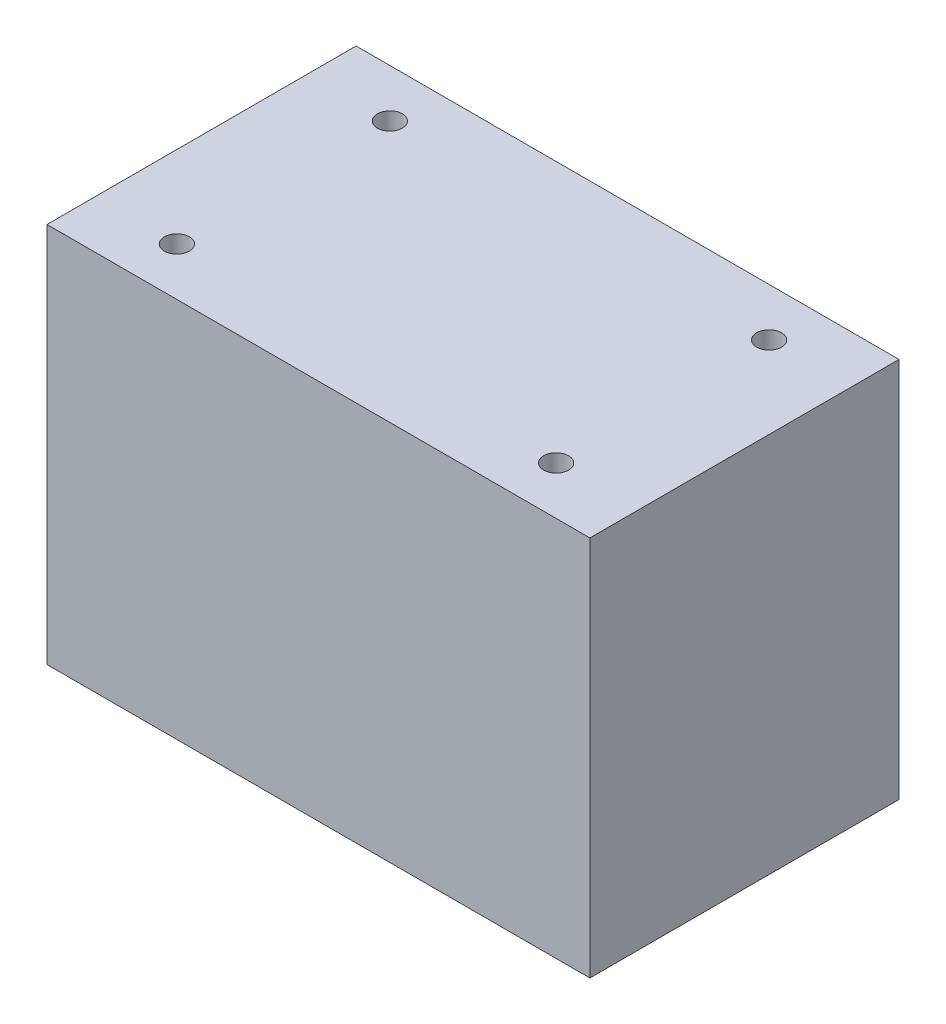
ISO-10303-21;
HEADER;
FILE_DESCRIPTION(('STEP AP214'),'2;1');
FILE_NAME('part.step','',(''),(''),'','','');
FILE_SCHEMA(('AUTOMOTIVE_DESIGN { 1 0 10303 214 1 1 1 1 }'));
ENDSEC;
DATA;
#1=APPLICATION_CONTEXT('core data for automotive mechanical design processes');
#2=APPLICATION_PROTOCOL_DEFINITION('international standard','automotive_design',2000,#1);
#3=PRODUCT_CONTEXT('',#1,'mechanical');
#4=PRODUCT('Part','Part','',(#3));
#5=PRODUCT_RELATED_PRODUCT_CATEGORY('part','',(#4));
#6=PRODUCT_DEFINITION_FORMATION('','',#4);
#7=PRODUCT_DEFINITION_CONTEXT('part definition',#1,'design');
#8=PRODUCT_DEFINITION('design','',#6,#7);
#9=PRODUCT_DEFINITION_SHAPE('','',#8);
#10=(LENGTH_UNIT() NAMED_UNIT(*) SI_UNIT(.MILLI.,.METRE.));
#11=(NAMED_UNIT(*) PLANE_ANGLE_UNIT() SI_UNIT($,.RADIAN.));
#12=(NAMED_UNIT(*) SI_UNIT($,.STERADIAN.) SOLID_ANGLE_UNIT());
#13=UNCERTAINTY_MEASURE_WITH_UNIT(LENGTH_MEASURE(1.E-05),#10,'distance_accuracy_value','');
#14=(GEOMETRIC_REPRESENTATION_CONTEXT(3) GLOBAL_UNCERTAINTY_ASSIGNED_CONTEXT((#13)) GLOBAL_UNIT_ASSIGNED_CONTEXT((#10,
#11,#12)) REPRESENTATION_CONTEXT('',''));
#15=CARTESIAN_POINT('',(0.,0.,0.));
#16=DIRECTION('',(0.,0.,1.));
#17=DIRECTION('',(1.,0.,0.));
#18=AXIS2_PLACEMENT_3D('',#15,#16,#17);
#19=CARTESIAN_POINT('',(52.25,73.36,29.75));
#20=DIRECTION('',(-1.,0.,0.));
#21=DIRECTION('',(0.,0.,1.));
#22=AXIS2_PLACEMENT_3D('',#19,#20,#21);
#23=PLANE('',#22);
#24=DIRECTION('',(0.,0.,-1.));
#25=VECTOR('',#24,1.);
#26=CARTESIAN_POINT('',(52.25,0.,29.75));
#27=LINE('',#26,#25);
#28=CARTESIAN_POINT('',(52.25,0.,29.75));
#29=VERTEX_POINT('',#28);
#30=CARTESIAN_POINT('',(52.25,0.,-29.75));
#31=VERTEX_POINT('',#30);
#32=EDGE_CURVE('E102',#29,#31,#27,.T.);
#33=ORIENTED_EDGE('',*,*,#32,.T.);
#34=DIRECTION('',(0.,-1.,0.));
#35=VECTOR('',#34,1.);
#36=CARTESIAN_POINT('',(52.25,73.36,-29.75));
#37=LINE('',#36,#35);
#38=CARTESIAN_POINT('',(52.25,73.36,-29.75));
#39=VERTEX_POINT('',#38);
#40=EDGE_CURVE('E11',#39,#31,#37,.T.);
#41=ORIENTED_EDGE('',*,*,#40,.F.);
#42=DIRECTION('',(0.,0.,-1.));
#43=VECTOR('',#42,1.);
#44=CARTESIAN_POINT('',(52.25,73.36,29.75));
#45=LINE('',#44,#43);
#46=CARTESIAN_POINT('',(52.25,73.36,29.75));
#47=VERTEX_POINT('',#46);
#48=EDGE_CURVE('E90',#47,#39,#45,.T.);
#49=ORIENTED_EDGE('',*,*,#48,.F.);
#50=DIRECTION('',(0.,-1.,0.));
#51=VECTOR('',#50,1.);
#52=CARTESIAN_POINT('',(52.25,73.36,29.75));
#53=LINE('',#52,#51);
#54=EDGE_CURVE('E98',#47,#29,#53,.T.);
#55=ORIENTED_EDGE('',*,*,#54,.T.);
#56=EDGE_LOOP('',(#33,#41,#49,#55));
#57=FACE_BOUND('',#56,.T.);
#58=ADVANCED_FACE('F39',(#57),#23,.F.);
#59=CARTESIAN_POINT('',(-52.25,73.36,-29.75));
#60=DIRECTION('',(0.,0.,1.));
#61=DIRECTION('',(1.,0.,0.));
#62=AXIS2_PLACEMENT_3D('',#59,#60,#61);
#63=PLANE('',#62);
#64=DIRECTION('',(-1.,0.,0.));
#65=VECTOR('',#64,1.);
#66=CARTESIAN_POINT('',(-52.25,0.,-29.75));
#67=LINE('',#66,#65);
#68=CARTESIAN_POINT('',(-52.25,0.,-29.75));
#69=VERTEX_POINT('',#68);
#70=EDGE_CURVE('E94',#31,#69,#67,.T.);
#71=ORIENTED_EDGE('',*,*,#70,.T.);
#72=DIRECTION('',(0.,-1.,0.));
#73=VECTOR('',#72,1.);
#74=CARTESIAN_POINT('',(-52.25,73.36,-29.75));
#75=LINE('',#74,#73);
#76=CARTESIAN_POINT('',(-52.25,73.36,-29.75));
#77=VERTEX_POINT('',#76);
#78=EDGE_CURVE('E47',#77,#69,#75,.T.);
#79=ORIENTED_EDGE('',*,*,#78,.F.);
#80=DIRECTION('',(-1.,0.,0.));
#81=VECTOR('',#80,1.);
#82=CARTESIAN_POINT('',(-52.25,73.36,-29.75));
#83=LINE('',#82,#81);
#84=EDGE_CURVE('E85',#39,#77,#83,.T.);
#85=ORIENTED_EDGE('',*,*,#84,.F.);
#86=ORIENTED_EDGE('',*,*,#40,.T.);
#87=EDGE_LOOP('',(#71,#79,#85,#86));
#88=FACE_BOUND('',#87,.T.);
#89=ADVANCED_FACE('F93',(#88),#63,.F.);
#90=CARTESIAN_POINT('',(-52.25,73.36,29.75));
#91=DIRECTION('',(1.,0.,0.));
#92=DIRECTION('',(0.,0.,-1.));
#93=AXIS2_PLACEMENT_3D('',#90,#91,#92);
#94=PLANE('',#93);
#95=DIRECTION('',(0.,0.,1.));
#96=VECTOR('',#95,1.);
#97=CARTESIAN_POINT('',(-52.25,0.,29.75));
#98=LINE('',#97,#96);
#99=CARTESIAN_POINT('',(-52.25,0.,29.75));
#100=VERTEX_POINT('',#99);
#101=EDGE_CURVE('E72',#69,#100,#98,.T.);
#102=ORIENTED_EDGE('',*,*,#101,.T.);
#103=DIRECTION('',(0.,-1.,0.));
#104=VECTOR('',#103,1.);
#105=CARTESIAN_POINT('',(-52.25,73.36,29.75));
#106=LINE('',#105,#104);
#107=CARTESIAN_POINT('',(-52.25,73.36,29.75));
#108=VERTEX_POINT('',#107);
#109=EDGE_CURVE('E95',#108,#100,#106,.T.);
#110=ORIENTED_EDGE('',*,*,#109,.F.);
#111=DIRECTION('',(0.,0.,1.));
#112=VECTOR('',#111,1.);
#113=CARTESIAN_POINT('',(-52.25,73.36,29.75));
#114=LINE('',#113,#112);
#115=EDGE_CURVE('E88',#77,#108,#114,.T.);
#116=ORIENTED_EDGE('',*,*,#115,.F.);
#117=ORIENTED_EDGE('',*,*,#78,.T.);
#118=EDGE_LOOP('',(#102,#110,#116,#117));
#119=FACE_BOUND('',#118,.T.);
#120=ADVANCED_FACE('F96',(#119),#94,.F.);
#121=CARTESIAN_POINT('',(-52.25,73.36,29.75));
#122=DIRECTION('',(0.,0.,-1.));
#123=DIRECTION('',(-1.,0.,0.));
#124=AXIS2_PLACEMENT_3D('',#121,#122,#123);
#125=PLANE('',#124);
#126=DIRECTION('',(1.,0.,0.));
#127=VECTOR('',#126,1.);
#128=CARTESIAN_POINT('',(-52.25,0.,29.75));
#129=LINE('',#128,#127);
#130=EDGE_CURVE('E78',#100,#29,#129,.T.);
#131=ORIENTED_EDGE('',*,*,#130,.T.);
#132=ORIENTED_EDGE('',*,*,#54,.F.);
#133=DIRECTION('',(1.,0.,0.));
#134=VECTOR('',#133,1.);
#135=CARTESIAN_POINT('',(-52.25,73.36,29.75));
#136=LINE('',#135,#134);
#137=EDGE_CURVE('E55',#108,#47,#136,.T.);
#138=ORIENTED_EDGE('',*,*,#137,.F.);
#139=ORIENTED_EDGE('',*,*,#109,.T.);
#140=EDGE_LOOP('',(#131,#132,#138,#139));
#141=FACE_BOUND('',#140,.T.);
#142=ADVANCED_FACE('F110',(#141),#125,.F.);
#143=CARTESIAN_POINT('',(0.,73.36,0.));
#144=DIRECTION('',(0.,-1.,0.));
#145=DIRECTION('',(0.,0.,-1.));
#146=AXIS2_PLACEMENT_3D('',#143,#144,#145);
#147=PLANE('',#146);
#148=CARTESIAN_POINT('',(-36.5,73.36,20.5));
#149=DIRECTION('',(0.,-1.,0.));
#150=DIRECTION('',(0.,0.,-1.));
#151=AXIS2_PLACEMENT_3D('',#148,#149,#150);
#152=CIRCLE('',#151,2.39999999999998);
#153=CARTESIAN_POINT('',(-36.5,73.36,18.1));
#154=VERTEX_POINT('',#153);
#155=EDGE_CURVE('E160',#154,#154,#152,.T.);
#156=ORIENTED_EDGE('',*,*,#155,.T.);
#157=EDGE_LOOP('',(#156));
#158=FACE_BOUND('',#157,.T.);
#159=CARTESIAN_POINT('',(36.5,73.36,20.5));
#160=DIRECTION('',(0.,-1.,0.));
#161=DIRECTION('',(0.,0.,-1.));
#162=AXIS2_PLACEMENT_3D('',#159,#160,#161);
#163=CIRCLE('',#162,2.39999999999998);
#164=CARTESIAN_POINT('',(36.5,73.36,18.1));
#165=VERTEX_POINT('',#164);
#166=EDGE_CURVE('E145',#165,#165,#163,.T.);
#167=ORIENTED_EDGE('',*,*,#166,.T.);
#168=EDGE_LOOP('',(#167));
#169=FACE_BOUND('',#168,.T.);
#170=CARTESIAN_POINT('',(36.5,73.36,-20.5));
#171=DIRECTION('',(0.,-1.,0.));
#172=DIRECTION('',(0.,0.,-1.));
#173=AXIS2_PLACEMENT_3D('',#170,#171,#172);
#174=CIRCLE('',#173,2.39999999999998);
#175=CARTESIAN_POINT('',(36.5,73.36,-22.9));
#176=VERTEX_POINT('',#175);
#177=EDGE_CURVE('E130',#176,#176,#174,.T.);
#178=ORIENTED_EDGE('',*,*,#177,.T.);
#179=EDGE_LOOP('',(#178));
#180=FACE_BOUND('',#179,.T.);
#181=CARTESIAN_POINT('',(-36.5,73.36,-20.5));
#182=DIRECTION('',(0.,-1.,0.));
#183=DIRECTION('',(0.,0.,-1.));
#184=AXIS2_PLACEMENT_3D('',#181,#182,#183);
#185=CIRCLE('',#184,2.39999999999998);
#186=CARTESIAN_POINT('',(-36.5,73.36,-22.9));
#187=VERTEX_POINT('',#186);
#188=EDGE_CURVE('E105',#187,#187,#185,.T.);
#189=ORIENTED_EDGE('',*,*,#188,.T.);
#190=EDGE_LOOP('',(#189));
#191=FACE_BOUND('',#190,.T.);
#192=ORIENTED_EDGE('',*,*,#48,.T.);
#193=ORIENTED_EDGE('',*,*,#84,.T.);
#194=ORIENTED_EDGE('',*,*,#115,.T.);
#195=ORIENTED_EDGE('',*,*,#137,.T.);
#196=EDGE_LOOP('',(#192,#193,#194,#195));
#197=FACE_BOUND('',#196,.T.);
#198=ADVANCED_FACE('F86',(#158,#169,#180,#191,#197),#147,.F.);
#199=CARTESIAN_POINT('',(0.,0.,0.));
#200=DIRECTION('',(0.,-1.,0.));
#201=DIRECTION('',(0.,0.,-1.));
#202=AXIS2_PLACEMENT_3D('',#199,#200,#201);
#203=PLANE('',#202);
#204=CARTESIAN_POINT('',(-36.5,0.,20.5));
#205=DIRECTION('',(0.,-1.,0.));
#206=DIRECTION('',(0.,0.,-1.));
#207=AXIS2_PLACEMENT_3D('',#204,#205,#206);
#208=CIRCLE('',#207,4.025);
#209=CARTESIAN_POINT('',(-36.5,0.,16.475));
#210=VERTEX_POINT('',#209);
#211=EDGE_CURVE('E172',#210,#210,#208,.T.);
#212=ORIENTED_EDGE('',*,*,#211,.F.);
#213=EDGE_LOOP('',(#212));
#214=FACE_BOUND('',#213,.T.);
#215=CARTESIAN_POINT('',(36.5,0.,20.5));
#216=DIRECTION('',(0.,-1.,0.));
#217=DIRECTION('',(0.,0.,-1.));
#218=AXIS2_PLACEMENT_3D('',#215,#216,#217);
#219=CIRCLE('',#218,4.025);
#220=CARTESIAN_POINT('',(36.5,0.,16.475));
#221=VERTEX_POINT('',#220);
#222=EDGE_CURVE('E157',#221,#221,#219,.T.);
#223=ORIENTED_EDGE('',*,*,#222,.F.);
#224=EDGE_LOOP('',(#223));
#225=FACE_BOUND('',#224,.T.);
#226=CARTESIAN_POINT('',(36.5,0.,-20.5));
#227=DIRECTION('',(0.,-1.,0.));
#228=DIRECTION('',(0.,0.,-1.));
#229=AXIS2_PLACEMENT_3D('',#226,#227,#228);
#230=CIRCLE('',#229,4.025);
#231=CARTESIAN_POINT('',(36.5,0.,-24.525));
#232=VERTEX_POINT('',#231);
#233=EDGE_CURVE('E142',#232,#232,#230,.T.);
#234=ORIENTED_EDGE('',*,*,#233,.F.);
#235=EDGE_LOOP('',(#234));
#236=FACE_BOUND('',#235,.T.);
#237=CARTESIAN_POINT('',(-36.5,0.,-20.5));
#238=DIRECTION('',(0.,-1.,0.));
#239=DIRECTION('',(0.,0.,-1.));
#240=AXIS2_PLACEMENT_3D('',#237,#238,#239);
#241=CIRCLE('',#240,4.025);
#242=CARTESIAN_POINT('',(-36.5,0.,-24.525));
#243=VERTEX_POINT('',#242);
#244=EDGE_CURVE('E127',#243,#243,#241,.T.);
#245=ORIENTED_EDGE('',*,*,#244,.F.);
#246=EDGE_LOOP('',(#245));
#247=FACE_BOUND('',#246,.T.);
#248=ORIENTED_EDGE('',*,*,#32,.F.);
#249=ORIENTED_EDGE('',*,*,#130,.F.);
#250=ORIENTED_EDGE('',*,*,#101,.F.);
#251=ORIENTED_EDGE('',*,*,#70,.F.);
#252=EDGE_LOOP('',(#248,#249,#250,#251));
#253=FACE_BOUND('',#252,.T.);
#254=ADVANCED_FACE('F113',(#214,#225,#236,#247,#253),#203,.T.);
#255=CARTESIAN_POINT('',(-36.5,0.,-20.5));
#256=DIRECTION('',(0.,-1.,0.));
#257=DIRECTION('',(0.,0.,-1.));
#258=AXIS2_PLACEMENT_3D('',#255,#256,#257);
#259=CYLINDRICAL_SURFACE('',#258,2.39999999999998);
#260=ORIENTED_EDGE('',*,*,#188,.F.);
#261=EDGE_LOOP('',(#260));
#262=FACE_BOUND('',#261,.T.);
#263=CARTESIAN_POINT('',(-36.5,59.,-20.5));
#264=DIRECTION('',(0.,-1.,0.));
#265=DIRECTION('',(0.,0.,-1.));
#266=AXIS2_PLACEMENT_3D('',#263,#264,#265);
#267=CIRCLE('',#266,2.39999999999999);
#268=CARTESIAN_POINT('',(-36.5,59.,-22.9));
#269=VERTEX_POINT('',#268);
#270=EDGE_CURVE('E118',#269,#269,#267,.T.);
#271=ORIENTED_EDGE('',*,*,#270,.T.);
#272=EDGE_LOOP('',(#271));
#273=FACE_BOUND('',#272,.T.);
#274=ADVANCED_FACE('F180',(#262,#273),#259,.F.);
#275=CARTESIAN_POINT('',(-32.5,59.,-20.5));
#276=DIRECTION('',(0.,1.,0.));
#277=DIRECTION('',(0.,0.,1.));
#278=AXIS2_PLACEMENT_3D('',#275,#276,#277);
#279=PLANE('',#278);
#280=ORIENTED_EDGE('',*,*,#270,.F.);
#281=EDGE_LOOP('',(#280));
#282=FACE_BOUND('',#281,.T.);
#283=CARTESIAN_POINT('',(-36.5,59.,-20.5));
#284=DIRECTION('',(0.,-1.,0.));
#285=DIRECTION('',(0.,0.,-1.));
#286=AXIS2_PLACEMENT_3D('',#283,#284,#285);
#287=CIRCLE('',#286,3.99999999999998);
#288=CARTESIAN_POINT('',(-36.5,59.,-24.5));
#289=VERTEX_POINT('',#288);
#290=EDGE_CURVE('E121',#289,#289,#287,.T.);
#291=ORIENTED_EDGE('',*,*,#290,.T.);
#292=EDGE_LOOP('',(#291));
#293=FACE_BOUND('',#292,.T.);
#294=ADVANCED_FACE('F201',(#282,#293),#279,.F.);
#295=CARTESIAN_POINT('',(-36.5,0.,-20.5));
#296=DIRECTION('',(0.,-1.,0.));
#297=DIRECTION('',(0.,0.,-1.));
#298=AXIS2_PLACEMENT_3D('',#295,#296,#297);
#299=CYLINDRICAL_SURFACE('',#298,3.99999999999999);
#300=ORIENTED_EDGE('',*,*,#290,.F.);
#301=EDGE_LOOP('',(#300));
#302=FACE_BOUND('',#301,.T.);
#303=CARTESIAN_POINT('',(-36.5,0.0250000000000061,-20.5));
#304=DIRECTION('',(0.,-1.,0.));
#305=DIRECTION('',(0.,0.,-1.));
#306=AXIS2_PLACEMENT_3D('',#303,#304,#305);
#307=CIRCLE('',#306,3.99999999999999);
#308=CARTESIAN_POINT('',(-36.5,0.0250000000000061,-24.5));
#309=VERTEX_POINT('',#308);
#310=EDGE_CURVE('E124',#309,#309,#307,.T.);
#311=ORIENTED_EDGE('',*,*,#310,.T.);
#312=EDGE_LOOP('',(#311));
#313=FACE_BOUND('',#312,.T.);
#314=ADVANCED_FACE('F191',(#302,#313),#299,.F.);
#315=CARTESIAN_POINT('',(-36.5,0.,-20.5));
#316=DIRECTION('',(0.,-1.,0.));
#317=DIRECTION('',(0.,0.,-1.));
#318=AXIS2_PLACEMENT_3D('',#315,#316,#317);
#319=CONICAL_SURFACE('',#318,4.025,0.785398163397548);
#320=ORIENTED_EDGE('',*,*,#310,.F.);
#321=EDGE_LOOP('',(#320));
#322=FACE_BOUND('',#321,.T.);
#323=ORIENTED_EDGE('',*,*,#244,.T.);
#324=EDGE_LOOP('',(#323));
#325=FACE_BOUND('',#324,.T.);
#326=ADVANCED_FACE('F188',(#322,#325),#319,.F.);
#327=CARTESIAN_POINT('',(36.5,0.,-20.5));
#328=DIRECTION('',(0.,-1.,0.));
#329=DIRECTION('',(0.,0.,-1.));
#330=AXIS2_PLACEMENT_3D('',#327,#328,#329);
#331=CYLINDRICAL_SURFACE('',#330,2.39999999999998);
#332=ORIENTED_EDGE('',*,*,#177,.F.);
#333=EDGE_LOOP('',(#332));
#334=FACE_BOUND('',#333,.T.);
#335=CARTESIAN_POINT('',(36.5,59.,-20.5));
#336=DIRECTION('',(0.,-1.,0.));
#337=DIRECTION('',(0.,0.,-1.));
#338=AXIS2_PLACEMENT_3D('',#335,#336,#337);
#339=CIRCLE('',#338,2.39999999999999);
#340=CARTESIAN_POINT('',(36.5,59.,-22.9));
#341=VERTEX_POINT('',#340);
#342=EDGE_CURVE('E133',#341,#341,#339,.T.);
#343=ORIENTED_EDGE('',*,*,#342,.T.);
#344=EDGE_LOOP('',(#343));
#345=FACE_BOUND('',#344,.T.);
#346=ADVANCED_FACE('F190',(#334,#345),#331,.F.);
#347=CARTESIAN_POINT('',(40.5,59.,-20.5));
#348=DIRECTION('',(0.,1.,0.));
#349=DIRECTION('',(0.,0.,1.));
#350=AXIS2_PLACEMENT_3D('',#347,#348,#349);
#351=PLANE('',#350);
#352=ORIENTED_EDGE('',*,*,#342,.F.);
#353=EDGE_LOOP('',(#352));
#354=FACE_BOUND('',#353,.T.);
#355=CARTESIAN_POINT('',(36.5,59.,-20.5));
#356=DIRECTION('',(0.,-1.,0.));
#357=DIRECTION('',(0.,0.,-1.));
#358=AXIS2_PLACEMENT_3D('',#355,#356,#357);
#359=CIRCLE('',#358,3.99999999999998);
#360=CARTESIAN_POINT('',(36.5,59.,-24.5));
#361=VERTEX_POINT('',#360);
#362=EDGE_CURVE('E136',#361,#361,#359,.T.);
#363=ORIENTED_EDGE('',*,*,#362,.T.);
#364=EDGE_LOOP('',(#363));
#365=FACE_BOUND('',#364,.T.);
#366=ADVANCED_FACE('F198',(#354,#365),#351,.F.);
#367=CARTESIAN_POINT('',(36.5,0.,-20.5));
#368=DIRECTION('',(0.,-1.,0.));
#369=DIRECTION('',(0.,0.,-1.));
#370=AXIS2_PLACEMENT_3D('',#367,#368,#369);
#371=CYLINDRICAL_SURFACE('',#370,3.99999999999999);
#372=ORIENTED_EDGE('',*,*,#362,.F.);
#373=EDGE_LOOP('',(#372));
#374=FACE_BOUND('',#373,.T.);
#375=CARTESIAN_POINT('',(36.5,0.0250000000000061,-20.5));
#376=DIRECTION('',(0.,-1.,0.));
#377=DIRECTION('',(0.,0.,-1.));
#378=AXIS2_PLACEMENT_3D('',#375,#376,#377);
#379=CIRCLE('',#378,3.99999999999999);
#380=CARTESIAN_POINT('',(36.5,0.0250000000000061,-24.5));
#381=VERTEX_POINT('',#380);
#382=EDGE_CURVE('E139',#381,#381,#379,.T.);
#383=ORIENTED_EDGE('',*,*,#382,.T.);
#384=EDGE_LOOP('',(#383));
#385=FACE_BOUND('',#384,.T.);
#386=ADVANCED_FACE('F258',(#374,#385),#371,.F.);
#387=CARTESIAN_POINT('',(36.5,0.,-20.5));
#388=DIRECTION('',(0.,-1.,0.));
#389=DIRECTION('',(0.,0.,-1.));
#390=AXIS2_PLACEMENT_3D('',#387,#388,#389);
#391=CONICAL_SURFACE('',#390,4.025,0.785398163397548);
#392=ORIENTED_EDGE('',*,*,#382,.F.);
#393=EDGE_LOOP('',(#392));
#394=FACE_BOUND('',#393,.T.);
#395=ORIENTED_EDGE('',*,*,#233,.T.);
#396=EDGE_LOOP('',(#395));
#397=FACE_BOUND('',#396,.T.);
#398=ADVANCED_FACE('F268',(#394,#397),#391,.F.);
#399=CARTESIAN_POINT('',(36.5,0.,20.5));
#400=DIRECTION('',(0.,-1.,0.));
#401=DIRECTION('',(0.,0.,-1.));
#402=AXIS2_PLACEMENT_3D('',#399,#400,#401);
#403=CYLINDRICAL_SURFACE('',#402,2.39999999999998);
#404=ORIENTED_EDGE('',*,*,#166,.F.);
#405=EDGE_LOOP('',(#404));
#406=FACE_BOUND('',#405,.T.);
#407=CARTESIAN_POINT('',(36.5,59.,20.5));
#408=DIRECTION('',(0.,-1.,0.));
#409=DIRECTION('',(0.,0.,-1.));
#410=AXIS2_PLACEMENT_3D('',#407,#408,#409);
#411=CIRCLE('',#410,2.39999999999999);
#412=CARTESIAN_POINT('',(36.5,59.,18.1));
#413=VERTEX_POINT('',#412);
#414=EDGE_CURVE('E148',#413,#413,#411,.T.);
#415=ORIENTED_EDGE('',*,*,#414,.T.);
#416=EDGE_LOOP('',(#415));
#417=FACE_BOUND('',#416,.T.);
#418=ADVANCED_FACE('F278',(#406,#417),#403,.F.);
#419=CARTESIAN_POINT('',(40.5,59.,20.5));
#420=DIRECTION('',(0.,1.,0.));
#421=DIRECTION('',(0.,0.,1.));
#422=AXIS2_PLACEMENT_3D('',#419,#420,#421);
#423=PLANE('',#422);
#424=ORIENTED_EDGE('',*,*,#414,.F.);
#425=EDGE_LOOP('',(#424));
#426=FACE_BOUND('',#425,.T.);
#427=CARTESIAN_POINT('',(36.5,59.,20.5));
#428=DIRECTION('',(0.,-1.,0.));
#429=DIRECTION('',(0.,0.,-1.));
#430=AXIS2_PLACEMENT_3D('',#427,#428,#429);
#431=CIRCLE('',#430,3.99999999999998);
#432=CARTESIAN_POINT('',(36.5,59.,16.5));
#433=VERTEX_POINT('',#432);
#434=EDGE_CURVE('E151',#433,#433,#431,.T.);
#435=ORIENTED_EDGE('',*,*,#434,.T.);
#436=EDGE_LOOP('',(#435));
#437=FACE_BOUND('',#436,.T.);
#438=ADVANCED_FACE('F288',(#426,#437),#423,.F.);
#439=CARTESIAN_POINT('',(36.5,0.,20.5));
#440=DIRECTION('',(0.,-1.,0.));
#441=DIRECTION('',(0.,0.,-1.));
#442=AXIS2_PLACEMENT_3D('',#439,#440,#441);
#443=CYLINDRICAL_SURFACE('',#442,3.99999999999999);
#444=ORIENTED_EDGE('',*,*,#434,.F.);
#445=EDGE_LOOP('',(#444));
#446=FACE_BOUND('',#445,.T.);
#447=CARTESIAN_POINT('',(36.5,0.0250000000000061,20.5));
#448=DIRECTION('',(0.,-1.,0.));
#449=DIRECTION('',(0.,0.,-1.));
#450=AXIS2_PLACEMENT_3D('',#447,#448,#449);
#451=CIRCLE('',#450,3.99999999999999);
#452=CARTESIAN_POINT('',(36.5,0.0250000000000061,16.5));
#453=VERTEX_POINT('',#452);
#454=EDGE_CURVE('E154',#453,#453,#451,.T.);
#455=ORIENTED_EDGE('',*,*,#454,.T.);
#456=EDGE_LOOP('',(#455));
#457=FACE_BOUND('',#456,.T.);
#458=ADVANCED_FACE('F298',(#446,#457),#443,.F.);
#459=CARTESIAN_POINT('',(36.5,0.,20.5));
#460=DIRECTION('',(0.,-1.,0.));
#461=DIRECTION('',(0.,0.,-1.));
#462=AXIS2_PLACEMENT_3D('',#459,#460,#461);
#463=CONICAL_SURFACE('',#462,4.025,0.785398163397548);
#464=ORIENTED_EDGE('',*,*,#454,.F.);
#465=EDGE_LOOP('',(#464));
#466=FACE_BOUND('',#465,.T.);
#467=ORIENTED_EDGE('',*,*,#222,.T.);
#468=EDGE_LOOP('',(#467));
#469=FACE_BOUND('',#468,.T.);
#470=ADVANCED_FACE('F308',(#466,#469),#463,.F.);
#471=CARTESIAN_POINT('',(-36.5,0.,20.5));
#472=DIRECTION('',(0.,-1.,0.));
#473=DIRECTION('',(0.,0.,-1.));
#474=AXIS2_PLACEMENT_3D('',#471,#472,#473);
#475=CYLINDRICAL_SURFACE('',#474,2.39999999999998);
#476=ORIENTED_EDGE('',*,*,#155,.F.);
#477=EDGE_LOOP('',(#476));
#478=FACE_BOUND('',#477,.T.);
#479=CARTESIAN_POINT('',(-36.5,59.,20.5));
#480=DIRECTION('',(0.,-1.,0.));
#481=DIRECTION('',(0.,0.,-1.));
#482=AXIS2_PLACEMENT_3D('',#479,#480,#481);
#483=CIRCLE('',#482,2.39999999999999);
#484=CARTESIAN_POINT('',(-36.5,59.,18.1));
#485=VERTEX_POINT('',#484);
#486=EDGE_CURVE('E163',#485,#485,#483,.T.);
#487=ORIENTED_EDGE('',*,*,#486,.T.);
#488=EDGE_LOOP('',(#487));
#489=FACE_BOUND('',#488,.T.);
#490=ADVANCED_FACE('F318',(#478,#489),#475,.F.);
#491=CARTESIAN_POINT('',(-32.5,59.,20.5));
#492=DIRECTION('',(0.,1.,0.));
#493=DIRECTION('',(0.,0.,1.));
#494=AXIS2_PLACEMENT_3D('',#491,#492,#493);
#495=PLANE('',#494);
#496=ORIENTED_EDGE('',*,*,#486,.F.);
#497=EDGE_LOOP('',(#496));
#498=FACE_BOUND('',#497,.T.);
#499=CARTESIAN_POINT('',(-36.5,59.,20.5));
#500=DIRECTION('',(0.,-1.,0.));
#501=DIRECTION('',(0.,0.,-1.));
#502=AXIS2_PLACEMENT_3D('',#499,#500,#501);
#503=CIRCLE('',#502,3.99999999999998);
#504=CARTESIAN_POINT('',(-36.5,59.,16.5));
#505=VERTEX_POINT('',#504);
#506=EDGE_CURVE('E166',#505,#505,#503,.T.);
#507=ORIENTED_EDGE('',*,*,#506,.T.);
#508=EDGE_LOOP('',(#507));
#509=FACE_BOUND('',#508,.T.);
#510=ADVANCED_FACE('F328',(#498,#509),#495,.F.);
#511=CARTESIAN_POINT('',(-36.5,0.,20.5));
#512=DIRECTION('',(0.,-1.,0.));
#513=DIRECTION('',(0.,0.,-1.));
#514=AXIS2_PLACEMENT_3D('',#511,#512,#513);
#515=CYLINDRICAL_SURFACE('',#514,3.99999999999999);
#516=ORIENTED_EDGE('',*,*,#506,.F.);
#517=EDGE_LOOP('',(#516));
#518=FACE_BOUND('',#517,.T.);
#519=CARTESIAN_POINT('',(-36.5,0.0250000000000061,20.5));
#520=DIRECTION('',(0.,-1.,0.));
#521=DIRECTION('',(0.,0.,-1.));
#522=AXIS2_PLACEMENT_3D('',#519,#520,#521);
#523=CIRCLE('',#522,3.99999999999999);
#524=CARTESIAN_POINT('',(-36.5,0.0250000000000061,16.5));
#525=VERTEX_POINT('',#524);
#526=EDGE_CURVE('E169',#525,#525,#523,.T.);
#527=ORIENTED_EDGE('',*,*,#526,.T.);
#528=EDGE_LOOP('',(#527));
#529=FACE_BOUND('',#528,.T.);
#530=ADVANCED_FACE('F338',(#518,#529),#515,.F.);
#531=CARTESIAN_POINT('',(-36.5,0.,20.5));
#532=DIRECTION('',(0.,-1.,0.));
#533=DIRECTION('',(0.,0.,-1.));
#534=AXIS2_PLACEMENT_3D('',#531,#532,#533);
#535=CONICAL_SURFACE('',#534,4.025,0.785398163397548);
#536=ORIENTED_EDGE('',*,*,#526,.F.);
#537=EDGE_LOOP('',(#536));
#538=FACE_BOUND('',#537,.T.);
#539=ORIENTED_EDGE('',*,*,#211,.T.);
#540=EDGE_LOOP('',(#539));
#541=FACE_BOUND('',#540,.T.);
#542=ADVANCED_FACE('F176',(#538,#541),#535,.F.);
#543=CLOSED_SHELL('',(#58,#89,#120,#142,#198,#254,#274,#294,#314,#326,#346,#366,#386,#398,#418,
#438,#458,#470,#490,#510,#530,#542));
#544=MANIFOLD_SOLID_BREP('B2',#543);
#545=ADVANCED_BREP_SHAPE_REPRESENTATION('',(#18,#544),#14);
#546=SHAPE_DEFINITION_REPRESENTATION(#9,#545);
ENDSEC;
END-ISO-10303-21;
